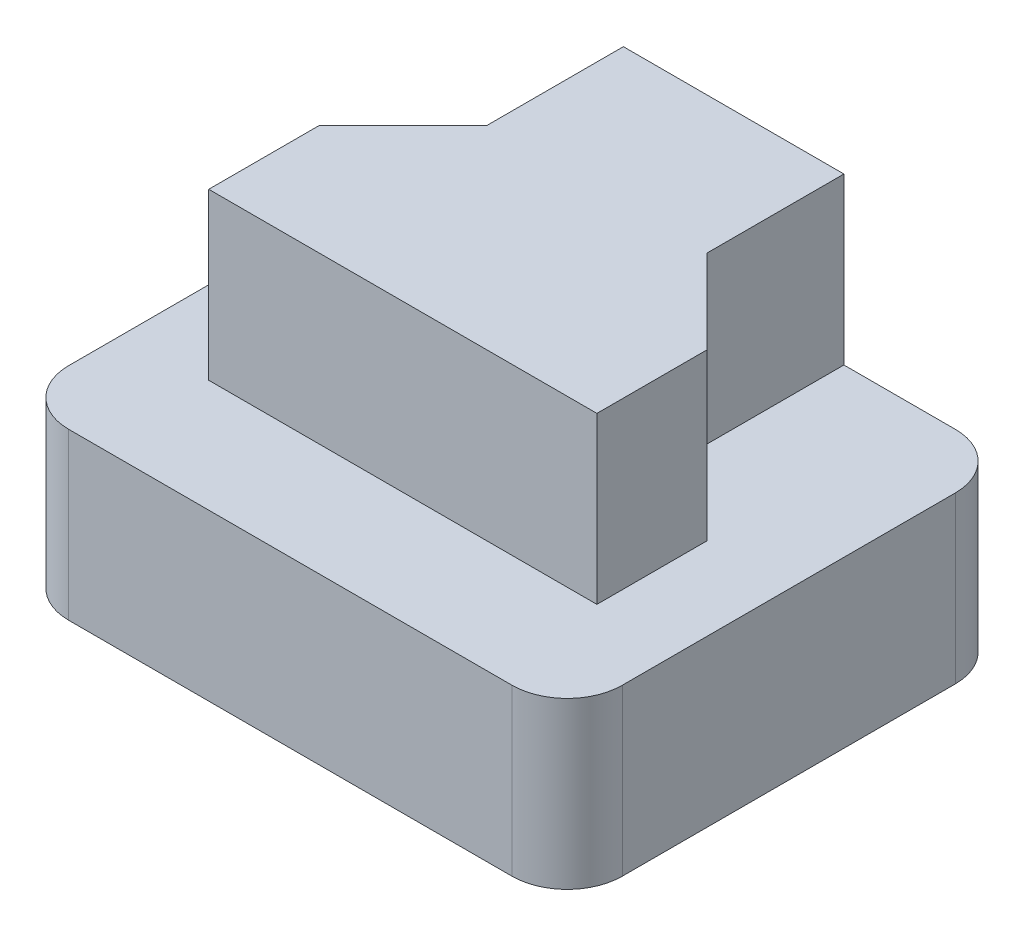
ISO-10303-21;
HEADER;
FILE_DESCRIPTION(('STEP AP214'),'2;1');
FILE_NAME('part.step','',(''),(''),'','','');
FILE_SCHEMA(('AUTOMOTIVE_DESIGN { 1 0 10303 214 1 1 1 1 }'));
ENDSEC;
DATA;
#1=APPLICATION_CONTEXT('core data for automotive mechanical design processes');
#2=APPLICATION_PROTOCOL_DEFINITION('international standard','automotive_design',2000,#1);
#3=PRODUCT_CONTEXT('',#1,'mechanical');
#4=PRODUCT('Part','Part','',(#3));
#5=PRODUCT_RELATED_PRODUCT_CATEGORY('part','',(#4));
#6=PRODUCT_DEFINITION_FORMATION('','',#4);
#7=PRODUCT_DEFINITION_CONTEXT('part definition',#1,'design');
#8=PRODUCT_DEFINITION('design','',#6,#7);
#9=PRODUCT_DEFINITION_SHAPE('','',#8);
#10=(LENGTH_UNIT() NAMED_UNIT(*) SI_UNIT(.MILLI.,.METRE.));
#11=(NAMED_UNIT(*) PLANE_ANGLE_UNIT() SI_UNIT($,.RADIAN.));
#12=(NAMED_UNIT(*) SI_UNIT($,.STERADIAN.) SOLID_ANGLE_UNIT());
#13=UNCERTAINTY_MEASURE_WITH_UNIT(LENGTH_MEASURE(1.E-05),#10,'distance_accuracy_value','');
#14=(GEOMETRIC_REPRESENTATION_CONTEXT(3) GLOBAL_UNCERTAINTY_ASSIGNED_CONTEXT((#13)) GLOBAL_UNIT_ASSIGNED_CONTEXT((#10,
#11,#12)) REPRESENTATION_CONTEXT('',''));
#15=CARTESIAN_POINT('',(0.,0.,0.));
#16=DIRECTION('',(0.,0.,1.));
#17=DIRECTION('',(1.,0.,0.));
#18=AXIS2_PLACEMENT_3D('',#15,#16,#17);
#19=CARTESIAN_POINT('',(5.02,3.,-4.02));
#20=DIRECTION('',(1.,0.,0.));
#21=DIRECTION('',(0.,0.,-1.));
#22=AXIS2_PLACEMENT_3D('',#19,#20,#21);
#23=PLANE('',#22);
#24=DIRECTION('',(0.,0.,1.));
#25=VECTOR('',#24,1.);
#26=CARTESIAN_POINT('',(5.02,3.,-4.02));
#27=LINE('',#26,#25);
#28=CARTESIAN_POINT('',(5.02,3.,-3.02));
#29=VERTEX_POINT('',#28);
#30=CARTESIAN_POINT('',(5.02,3.,3.02));
#31=VERTEX_POINT('',#30);
#32=EDGE_CURVE('E234',#29,#31,#27,.T.);
#33=ORIENTED_EDGE('',*,*,#32,.T.);
#34=DIRECTION('',(0.,-1.,0.));
#35=VECTOR('',#34,1.);
#36=CARTESIAN_POINT('',(5.02,3.,3.02));
#37=LINE('',#36,#35);
#38=CARTESIAN_POINT('',(5.02,0.,3.02));
#39=VERTEX_POINT('',#38);
#40=EDGE_CURVE('E257',#31,#39,#37,.T.);
#41=ORIENTED_EDGE('',*,*,#40,.T.);
#42=DIRECTION('',(0.,0.,1.));
#43=VECTOR('',#42,1.);
#44=CARTESIAN_POINT('',(5.02,0.,-4.02));
#45=LINE('',#44,#43);
#46=CARTESIAN_POINT('',(5.02,0.,-3.02));
#47=VERTEX_POINT('',#46);
#48=EDGE_CURVE('E221',#47,#39,#45,.T.);
#49=ORIENTED_EDGE('',*,*,#48,.F.);
#50=DIRECTION('',(0.,-1.,0.));
#51=VECTOR('',#50,1.);
#52=CARTESIAN_POINT('',(5.02,3.,-3.02));
#53=LINE('',#52,#51);
#54=EDGE_CURVE('E246',#47,#29,#53,.F.);
#55=ORIENTED_EDGE('',*,*,#54,.T.);
#56=EDGE_LOOP('',(#33,#41,#49,#55));
#57=FACE_BOUND('',#56,.T.);
#58=ADVANCED_FACE('F45',(#57),#23,.T.);
#59=CARTESIAN_POINT('',(5.02,3.,-4.02));
#60=DIRECTION('',(0.,0.,1.));
#61=DIRECTION('',(1.,0.,0.));
#62=AXIS2_PLACEMENT_3D('',#59,#60,#61);
#63=PLANE('',#62);
#64=DIRECTION('',(-1.,0.,0.));
#65=VECTOR('',#64,1.);
#66=CARTESIAN_POINT('',(5.02,0.,-4.02));
#67=LINE('',#66,#65);
#68=CARTESIAN_POINT('',(4.02,0.,-4.02));
#69=VERTEX_POINT('',#68);
#70=CARTESIAN_POINT('',(-4.02,0.,-4.02));
#71=VERTEX_POINT('',#70);
#72=EDGE_CURVE('E238',#69,#71,#67,.T.);
#73=ORIENTED_EDGE('',*,*,#72,.T.);
#74=DIRECTION('',(0.,-1.,0.));
#75=VECTOR('',#74,1.);
#76=CARTESIAN_POINT('',(-4.02,3.,-4.02));
#77=LINE('',#76,#75);
#78=CARTESIAN_POINT('',(-4.02,3.,-4.02));
#79=VERTEX_POINT('',#78);
#80=EDGE_CURVE('E11',#71,#79,#77,.F.);
#81=ORIENTED_EDGE('',*,*,#80,.T.);
#82=DIRECTION('',(-1.,0.,0.));
#83=VECTOR('',#82,1.);
#84=CARTESIAN_POINT('',(5.02,3.,-4.02));
#85=LINE('',#84,#83);
#86=CARTESIAN_POINT('',(-2.,3.,-4.02));
#87=VERTEX_POINT('',#86);
#88=EDGE_CURVE('E243',#87,#79,#85,.T.);
#89=ORIENTED_EDGE('',*,*,#88,.F.);
#90=DIRECTION('',(0.,-1.,0.));
#91=VECTOR('',#90,1.);
#92=CARTESIAN_POINT('',(-2.,6.,-4.02));
#93=LINE('',#92,#91);
#94=CARTESIAN_POINT('',(-2.,6.,-4.02));
#95=VERTEX_POINT('',#94);
#96=EDGE_CURVE('E229',#95,#87,#93,.T.);
#97=ORIENTED_EDGE('',*,*,#96,.F.);
#98=DIRECTION('',(1.,0.,0.));
#99=VECTOR('',#98,1.);
#100=CARTESIAN_POINT('',(0.,6.,-4.02));
#101=LINE('',#100,#99);
#102=CARTESIAN_POINT('',(2.,6.,-4.02));
#103=VERTEX_POINT('',#102);
#104=EDGE_CURVE('E196',#95,#103,#101,.T.);
#105=ORIENTED_EDGE('',*,*,#104,.T.);
#106=DIRECTION('',(0.,-1.,0.));
#107=VECTOR('',#106,1.);
#108=CARTESIAN_POINT('',(2.,6.,-4.02));
#109=LINE('',#108,#107);
#110=CARTESIAN_POINT('',(2.,3.,-4.02));
#111=VERTEX_POINT('',#110);
#112=EDGE_CURVE('E226',#103,#111,#109,.T.);
#113=ORIENTED_EDGE('',*,*,#112,.T.);
#114=CARTESIAN_POINT('',(4.02,3.,-4.02));
#115=VERTEX_POINT('',#114);
#116=EDGE_CURVE('E244',#115,#111,#85,.T.);
#117=ORIENTED_EDGE('',*,*,#116,.F.);
#118=DIRECTION('',(0.,-1.,0.));
#119=VECTOR('',#118,1.);
#120=CARTESIAN_POINT('',(4.02,0.,-4.02));
#121=LINE('',#120,#119);
#122=EDGE_CURVE('E53',#115,#69,#121,.T.);
#123=ORIENTED_EDGE('',*,*,#122,.T.);
#124=EDGE_LOOP('',(#73,#81,#89,#97,#105,#113,#117,#123));
#125=FACE_BOUND('',#124,.T.);
#126=ADVANCED_FACE('F287',(#125),#63,.F.);
#127=CARTESIAN_POINT('',(-5.02,3.,-4.02));
#128=DIRECTION('',(1.,0.,0.));
#129=DIRECTION('',(0.,0.,-1.));
#130=AXIS2_PLACEMENT_3D('',#127,#128,#129);
#131=PLANE('',#130);
#132=DIRECTION('',(0.,0.,1.));
#133=VECTOR('',#132,1.);
#134=CARTESIAN_POINT('',(-5.02,0.,-4.02));
#135=LINE('',#134,#133);
#136=CARTESIAN_POINT('',(-5.02,0.,-3.02));
#137=VERTEX_POINT('',#136);
#138=CARTESIAN_POINT('',(-5.02,0.,3.02));
#139=VERTEX_POINT('',#138);
#140=EDGE_CURVE('E252',#137,#139,#135,.T.);
#141=ORIENTED_EDGE('',*,*,#140,.T.);
#142=DIRECTION('',(0.,-1.,0.));
#143=VECTOR('',#142,1.);
#144=CARTESIAN_POINT('',(-5.02,3.,3.02));
#145=LINE('',#144,#143);
#146=CARTESIAN_POINT('',(-5.02,3.,3.02));
#147=VERTEX_POINT('',#146);
#148=EDGE_CURVE('E68',#139,#147,#145,.F.);
#149=ORIENTED_EDGE('',*,*,#148,.T.);
#150=DIRECTION('',(0.,0.,1.));
#151=VECTOR('',#150,1.);
#152=CARTESIAN_POINT('',(-5.02,3.,-4.02));
#153=LINE('',#152,#151);
#154=CARTESIAN_POINT('',(-5.02,3.,-3.02));
#155=VERTEX_POINT('',#154);
#156=EDGE_CURVE('E241',#155,#147,#153,.T.);
#157=ORIENTED_EDGE('',*,*,#156,.F.);
#158=DIRECTION('',(0.,-1.,0.));
#159=VECTOR('',#158,1.);
#160=CARTESIAN_POINT('',(-5.02,3.,-3.02));
#161=LINE('',#160,#159);
#162=EDGE_CURVE('E280',#155,#137,#161,.T.);
#163=ORIENTED_EDGE('',*,*,#162,.T.);
#164=EDGE_LOOP('',(#141,#149,#157,#163));
#165=FACE_BOUND('',#164,.T.);
#166=ADVANCED_FACE('F298',(#165),#131,.F.);
#167=CARTESIAN_POINT('',(5.02,3.,4.02));
#168=DIRECTION('',(0.,0.,1.));
#169=DIRECTION('',(1.,0.,0.));
#170=AXIS2_PLACEMENT_3D('',#167,#168,#169);
#171=PLANE('',#170);
#172=DIRECTION('',(-1.,0.,0.));
#173=VECTOR('',#172,1.);
#174=CARTESIAN_POINT('',(5.02,0.,4.02));
#175=LINE('',#174,#173);
#176=CARTESIAN_POINT('',(4.02,0.,4.02));
#177=VERTEX_POINT('',#176);
#178=CARTESIAN_POINT('',(-4.02,0.,4.02));
#179=VERTEX_POINT('',#178);
#180=EDGE_CURVE('E249',#177,#179,#175,.T.);
#181=ORIENTED_EDGE('',*,*,#180,.F.);
#182=DIRECTION('',(0.,-1.,0.));
#183=VECTOR('',#182,1.);
#184=CARTESIAN_POINT('',(4.02,3.,4.02));
#185=LINE('',#184,#183);
#186=CARTESIAN_POINT('',(4.02,3.,4.02));
#187=VERTEX_POINT('',#186);
#188=EDGE_CURVE('E271',#177,#187,#185,.F.);
#189=ORIENTED_EDGE('',*,*,#188,.T.);
#190=DIRECTION('',(-1.,0.,0.));
#191=VECTOR('',#190,1.);
#192=CARTESIAN_POINT('',(5.02,3.,4.02));
#193=LINE('',#192,#191);
#194=CARTESIAN_POINT('',(-4.02,3.,4.02));
#195=VERTEX_POINT('',#194);
#196=EDGE_CURVE('E237',#187,#195,#193,.T.);
#197=ORIENTED_EDGE('',*,*,#196,.T.);
#198=DIRECTION('',(0.,-1.,0.));
#199=VECTOR('',#198,1.);
#200=CARTESIAN_POINT('',(-4.02,0.,4.02));
#201=LINE('',#200,#199);
#202=EDGE_CURVE('E268',#195,#179,#201,.T.);
#203=ORIENTED_EDGE('',*,*,#202,.T.);
#204=EDGE_LOOP('',(#181,#189,#197,#203));
#205=FACE_BOUND('',#204,.T.);
#206=ADVANCED_FACE('F308',(#205),#171,.T.);
#207=CARTESIAN_POINT('',(0.,3.,0.));
#208=DIRECTION('',(0.,-1.,0.));
#209=DIRECTION('',(0.,0.,-1.));
#210=AXIS2_PLACEMENT_3D('',#207,#208,#209);
#211=PLANE('',#210);
#212=ORIENTED_EDGE('',*,*,#196,.F.);
#213=CARTESIAN_POINT('',(4.02,3.,3.02));
#214=DIRECTION('',(0.,-1.,0.));
#215=DIRECTION('',(0.,0.,-1.));
#216=AXIS2_PLACEMENT_3D('',#213,#214,#215);
#217=CIRCLE('',#216,1.);
#218=EDGE_CURVE('E278',#187,#31,#217,.F.);
#219=ORIENTED_EDGE('',*,*,#218,.T.);
#220=ORIENTED_EDGE('',*,*,#32,.F.);
#221=CARTESIAN_POINT('',(4.02,3.,-3.02));
#222=DIRECTION('',(0.,-1.,0.));
#223=DIRECTION('',(0.,0.,-1.));
#224=AXIS2_PLACEMENT_3D('',#221,#222,#223);
#225=CIRCLE('',#224,1.);
#226=EDGE_CURVE('E60',#29,#115,#225,.F.);
#227=ORIENTED_EDGE('',*,*,#226,.T.);
#228=ORIENTED_EDGE('',*,*,#116,.T.);
#229=DIRECTION('',(0.,0.,1.));
#230=VECTOR('',#229,1.);
#231=CARTESIAN_POINT('',(2.,3.,0.));
#232=LINE('',#231,#230);
#233=CARTESIAN_POINT('',(2.,3.,-1.54000000000001));
#234=VERTEX_POINT('',#233);
#235=EDGE_CURVE('E215',#111,#234,#232,.T.);
#236=ORIENTED_EDGE('',*,*,#235,.T.);
#237=DIRECTION('',(0.707106781186546,0.,0.707106781186549));
#238=VECTOR('',#237,1.);
#239=CARTESIAN_POINT('',(1.77000000000001,3.,-1.77));
#240=LINE('',#239,#238);
#241=CARTESIAN_POINT('',(3.52,3.,-0.0199999999999998));
#242=VERTEX_POINT('',#241);
#243=EDGE_CURVE('E189',#234,#242,#240,.T.);
#244=ORIENTED_EDGE('',*,*,#243,.T.);
#245=DIRECTION('',(0.,0.,1.));
#246=VECTOR('',#245,1.);
#247=CARTESIAN_POINT('',(3.52,3.,0.));
#248=LINE('',#247,#246);
#249=CARTESIAN_POINT('',(3.52,3.,1.98));
#250=VERTEX_POINT('',#249);
#251=EDGE_CURVE('E186',#242,#250,#248,.T.);
#252=ORIENTED_EDGE('',*,*,#251,.T.);
#253=DIRECTION('',(-1.,0.,0.));
#254=VECTOR('',#253,1.);
#255=CARTESIAN_POINT('',(0.,3.,1.98));
#256=LINE('',#255,#254);
#257=CARTESIAN_POINT('',(-3.52,3.,1.98));
#258=VERTEX_POINT('',#257);
#259=EDGE_CURVE('E206',#250,#258,#256,.T.);
#260=ORIENTED_EDGE('',*,*,#259,.T.);
#261=DIRECTION('',(0.,0.,-1.));
#262=VECTOR('',#261,1.);
#263=CARTESIAN_POINT('',(-3.52,3.,0.));
#264=LINE('',#263,#262);
#265=CARTESIAN_POINT('',(-3.52,3.,-0.019999999999999));
#266=VERTEX_POINT('',#265);
#267=EDGE_CURVE('E165',#258,#266,#264,.T.);
#268=ORIENTED_EDGE('',*,*,#267,.T.);
#269=DIRECTION('',(0.707106781186546,0.,-0.707106781186549));
#270=VECTOR('',#269,1.);
#271=CARTESIAN_POINT('',(-1.77000000000001,3.,-1.77));
#272=LINE('',#271,#270);
#273=CARTESIAN_POINT('',(-2.,3.,-1.54000000000001));
#274=VERTEX_POINT('',#273);
#275=EDGE_CURVE('E209',#266,#274,#272,.T.);
#276=ORIENTED_EDGE('',*,*,#275,.T.);
#277=DIRECTION('',(0.,0.,-1.));
#278=VECTOR('',#277,1.);
#279=CARTESIAN_POINT('',(-2.,3.,0.));
#280=LINE('',#279,#278);
#281=EDGE_CURVE('E212',#274,#87,#280,.T.);
#282=ORIENTED_EDGE('',*,*,#281,.T.);
#283=ORIENTED_EDGE('',*,*,#88,.T.);
#284=CARTESIAN_POINT('',(-4.02,3.,-3.02));
#285=DIRECTION('',(0.,-1.,0.));
#286=DIRECTION('',(0.,0.,-1.));
#287=AXIS2_PLACEMENT_3D('',#284,#285,#286);
#288=CIRCLE('',#287,1.);
#289=EDGE_CURVE('E274',#79,#155,#288,.F.);
#290=ORIENTED_EDGE('',*,*,#289,.T.);
#291=ORIENTED_EDGE('',*,*,#156,.T.);
#292=CARTESIAN_POINT('',(-4.02,3.,3.02));
#293=DIRECTION('',(0.,-1.,0.));
#294=DIRECTION('',(0.,0.,-1.));
#295=AXIS2_PLACEMENT_3D('',#292,#293,#294);
#296=CIRCLE('',#295,1.);
#297=EDGE_CURVE('E276',#147,#195,#296,.F.);
#298=ORIENTED_EDGE('',*,*,#297,.T.);
#299=EDGE_LOOP('',(#212,#219,#220,#227,#228,#236,#244,#252,#260,#268,#276,#282,#283,#290,#291,#298));
#300=FACE_BOUND('',#299,.T.);
#301=ADVANCED_FACE('F301',(#300),#211,.F.);
#302=CARTESIAN_POINT('',(0.,0.,0.));
#303=DIRECTION('',(0.,-1.,0.));
#304=DIRECTION('',(0.,0.,-1.));
#305=AXIS2_PLACEMENT_3D('',#302,#303,#304);
#306=PLANE('',#305);
#307=ORIENTED_EDGE('',*,*,#48,.T.);
#308=CARTESIAN_POINT('',(4.02,0.,3.02));
#309=DIRECTION('',(0.,-1.,0.));
#310=DIRECTION('',(0.,0.,-1.));
#311=AXIS2_PLACEMENT_3D('',#308,#309,#310);
#312=CIRCLE('',#311,1.);
#313=EDGE_CURVE('E266',#39,#177,#312,.T.);
#314=ORIENTED_EDGE('',*,*,#313,.T.);
#315=ORIENTED_EDGE('',*,*,#180,.T.);
#316=CARTESIAN_POINT('',(-4.02,0.,3.02));
#317=DIRECTION('',(0.,-1.,0.));
#318=DIRECTION('',(0.,0.,-1.));
#319=AXIS2_PLACEMENT_3D('',#316,#317,#318);
#320=CIRCLE('',#319,1.);
#321=EDGE_CURVE('E264',#179,#139,#320,.T.);
#322=ORIENTED_EDGE('',*,*,#321,.T.);
#323=ORIENTED_EDGE('',*,*,#140,.F.);
#324=CARTESIAN_POINT('',(-4.02,0.,-3.02));
#325=DIRECTION('',(0.,-1.,0.));
#326=DIRECTION('',(0.,0.,-1.));
#327=AXIS2_PLACEMENT_3D('',#324,#325,#326);
#328=CIRCLE('',#327,1.);
#329=EDGE_CURVE('E262',#137,#71,#328,.T.);
#330=ORIENTED_EDGE('',*,*,#329,.T.);
#331=ORIENTED_EDGE('',*,*,#72,.F.);
#332=CARTESIAN_POINT('',(4.02,0.,-3.02));
#333=DIRECTION('',(0.,-1.,0.));
#334=DIRECTION('',(0.,0.,-1.));
#335=AXIS2_PLACEMENT_3D('',#332,#333,#334);
#336=CIRCLE('',#335,1.);
#337=EDGE_CURVE('E260',#69,#47,#336,.T.);
#338=ORIENTED_EDGE('',*,*,#337,.T.);
#339=EDGE_LOOP('',(#307,#314,#315,#322,#323,#330,#331,#338));
#340=FACE_BOUND('',#339,.T.);
#341=ADVANCED_FACE('F291',(#340),#306,.T.);
#342=CARTESIAN_POINT('',(0.,6.,1.98));
#343=DIRECTION('',(0.,0.,1.));
#344=DIRECTION('',(1.,0.,0.));
#345=AXIS2_PLACEMENT_3D('',#342,#343,#344);
#346=PLANE('',#345);
#347=ORIENTED_EDGE('',*,*,#259,.F.);
#348=DIRECTION('',(0.,-1.,0.));
#349=VECTOR('',#348,1.);
#350=CARTESIAN_POINT('',(3.52,6.,1.98));
#351=LINE('',#350,#349);
#352=CARTESIAN_POINT('',(3.52,6.,1.98));
#353=VERTEX_POINT('',#352);
#354=EDGE_CURVE('E185',#353,#250,#351,.T.);
#355=ORIENTED_EDGE('',*,*,#354,.F.);
#356=DIRECTION('',(-1.,0.,0.));
#357=VECTOR('',#356,1.);
#358=CARTESIAN_POINT('',(0.,6.,1.98));
#359=LINE('',#358,#357);
#360=CARTESIAN_POINT('',(-3.52,6.,1.98));
#361=VERTEX_POINT('',#360);
#362=EDGE_CURVE('E177',#353,#361,#359,.T.);
#363=ORIENTED_EDGE('',*,*,#362,.T.);
#364=DIRECTION('',(0.,-1.,0.));
#365=VECTOR('',#364,1.);
#366=CARTESIAN_POINT('',(-3.52,6.,1.98));
#367=LINE('',#366,#365);
#368=EDGE_CURVE('E160',#361,#258,#367,.T.);
#369=ORIENTED_EDGE('',*,*,#368,.T.);
#370=EDGE_LOOP('',(#347,#355,#363,#369));
#371=FACE_BOUND('',#370,.T.);
#372=ADVANCED_FACE('F183',(#371),#346,.T.);
#373=CARTESIAN_POINT('',(3.52,6.,0.));
#374=DIRECTION('',(1.,0.,0.));
#375=DIRECTION('',(0.,0.,-1.));
#376=AXIS2_PLACEMENT_3D('',#373,#374,#375);
#377=PLANE('',#376);
#378=ORIENTED_EDGE('',*,*,#251,.F.);
#379=DIRECTION('',(0.,-1.,0.));
#380=VECTOR('',#379,1.);
#381=CARTESIAN_POINT('',(3.52,6.,-0.0199999999999998));
#382=LINE('',#381,#380);
#383=CARTESIAN_POINT('',(3.52,6.,-0.0199999999999998));
#384=VERTEX_POINT('',#383);
#385=EDGE_CURVE('E222',#384,#242,#382,.T.);
#386=ORIENTED_EDGE('',*,*,#385,.F.);
#387=DIRECTION('',(0.,0.,1.));
#388=VECTOR('',#387,1.);
#389=CARTESIAN_POINT('',(3.52,6.,0.));
#390=LINE('',#389,#388);
#391=EDGE_CURVE('E170',#384,#353,#390,.T.);
#392=ORIENTED_EDGE('',*,*,#391,.T.);
#393=ORIENTED_EDGE('',*,*,#354,.T.);
#394=EDGE_LOOP('',(#378,#386,#392,#393));
#395=FACE_BOUND('',#394,.T.);
#396=ADVANCED_FACE('F404',(#395),#377,.T.);
#397=CARTESIAN_POINT('',(1.77000000000001,6.,-1.77));
#398=DIRECTION('',(0.707106781186549,0.,-0.707106781186546));
#399=DIRECTION('',(-0.707106781186546,0.,-0.707106781186549));
#400=AXIS2_PLACEMENT_3D('',#397,#398,#399);
#401=PLANE('',#400);
#402=ORIENTED_EDGE('',*,*,#243,.F.);
#403=DIRECTION('',(0.,-1.,0.));
#404=VECTOR('',#403,1.);
#405=CARTESIAN_POINT('',(2.,6.,-1.54000000000001));
#406=LINE('',#405,#404);
#407=CARTESIAN_POINT('',(2.,6.,-1.54000000000001));
#408=VERTEX_POINT('',#407);
#409=EDGE_CURVE('E224',#408,#234,#406,.T.);
#410=ORIENTED_EDGE('',*,*,#409,.F.);
#411=DIRECTION('',(0.707106781186546,0.,0.707106781186549));
#412=VECTOR('',#411,1.);
#413=CARTESIAN_POINT('',(1.77000000000001,6.,-1.77));
#414=LINE('',#413,#412);
#415=EDGE_CURVE('E202',#408,#384,#414,.T.);
#416=ORIENTED_EDGE('',*,*,#415,.T.);
#417=ORIENTED_EDGE('',*,*,#385,.T.);
#418=EDGE_LOOP('',(#402,#410,#416,#417));
#419=FACE_BOUND('',#418,.T.);
#420=ADVANCED_FACE('F395',(#419),#401,.T.);
#421=CARTESIAN_POINT('',(2.,6.,0.));
#422=DIRECTION('',(1.,0.,0.));
#423=DIRECTION('',(0.,0.,-1.));
#424=AXIS2_PLACEMENT_3D('',#421,#422,#423);
#425=PLANE('',#424);
#426=ORIENTED_EDGE('',*,*,#235,.F.);
#427=ORIENTED_EDGE('',*,*,#112,.F.);
#428=DIRECTION('',(0.,0.,1.));
#429=VECTOR('',#428,1.);
#430=CARTESIAN_POINT('',(2.,6.,0.));
#431=LINE('',#430,#429);
#432=EDGE_CURVE('E199',#103,#408,#431,.T.);
#433=ORIENTED_EDGE('',*,*,#432,.T.);
#434=ORIENTED_EDGE('',*,*,#409,.T.);
#435=EDGE_LOOP('',(#426,#427,#433,#434));
#436=FACE_BOUND('',#435,.T.);
#437=ADVANCED_FACE('F386',(#436),#425,.T.);
#438=CARTESIAN_POINT('',(-2.,6.,0.));
#439=DIRECTION('',(-1.,0.,0.));
#440=DIRECTION('',(0.,0.,1.));
#441=AXIS2_PLACEMENT_3D('',#438,#439,#440);
#442=PLANE('',#441);
#443=ORIENTED_EDGE('',*,*,#281,.F.);
#444=DIRECTION('',(0.,-1.,0.));
#445=VECTOR('',#444,1.);
#446=CARTESIAN_POINT('',(-2.,6.,-1.54000000000001));
#447=LINE('',#446,#445);
#448=CARTESIAN_POINT('',(-2.,6.,-1.54000000000001));
#449=VERTEX_POINT('',#448);
#450=EDGE_CURVE('E231',#449,#274,#447,.T.);
#451=ORIENTED_EDGE('',*,*,#450,.F.);
#452=DIRECTION('',(0.,0.,-1.));
#453=VECTOR('',#452,1.);
#454=CARTESIAN_POINT('',(-2.,6.,0.));
#455=LINE('',#454,#453);
#456=EDGE_CURVE('E193',#449,#95,#455,.T.);
#457=ORIENTED_EDGE('',*,*,#456,.T.);
#458=ORIENTED_EDGE('',*,*,#96,.T.);
#459=EDGE_LOOP('',(#443,#451,#457,#458));
#460=FACE_BOUND('',#459,.T.);
#461=ADVANCED_FACE('F377',(#460),#442,.T.);
#462=CARTESIAN_POINT('',(-1.77000000000001,6.,-1.77));
#463=DIRECTION('',(-0.707106781186549,0.,-0.707106781186546));
#464=DIRECTION('',(-0.707106781186546,0.,0.707106781186549));
#465=AXIS2_PLACEMENT_3D('',#462,#463,#464);
#466=PLANE('',#465);
#467=ORIENTED_EDGE('',*,*,#275,.F.);
#468=DIRECTION('',(0.,-1.,0.));
#469=VECTOR('',#468,1.);
#470=CARTESIAN_POINT('',(-3.52,6.,-0.019999999999999));
#471=LINE('',#470,#469);
#472=CARTESIAN_POINT('',(-3.52,6.,-0.019999999999999));
#473=VERTEX_POINT('',#472);
#474=EDGE_CURVE('E169',#473,#266,#471,.T.);
#475=ORIENTED_EDGE('',*,*,#474,.F.);
#476=DIRECTION('',(0.707106781186546,0.,-0.707106781186549));
#477=VECTOR('',#476,1.);
#478=CARTESIAN_POINT('',(-1.77000000000001,6.,-1.77));
#479=LINE('',#478,#477);
#480=EDGE_CURVE('E181',#473,#449,#479,.T.);
#481=ORIENTED_EDGE('',*,*,#480,.T.);
#482=ORIENTED_EDGE('',*,*,#450,.T.);
#483=EDGE_LOOP('',(#467,#475,#481,#482));
#484=FACE_BOUND('',#483,.T.);
#485=ADVANCED_FACE('F369',(#484),#466,.T.);
#486=CARTESIAN_POINT('',(-3.52,6.,0.));
#487=DIRECTION('',(-1.,0.,0.));
#488=DIRECTION('',(0.,0.,1.));
#489=AXIS2_PLACEMENT_3D('',#486,#487,#488);
#490=PLANE('',#489);
#491=ORIENTED_EDGE('',*,*,#267,.F.);
#492=ORIENTED_EDGE('',*,*,#368,.F.);
#493=DIRECTION('',(0.,0.,-1.));
#494=VECTOR('',#493,1.);
#495=CARTESIAN_POINT('',(-3.52,6.,0.));
#496=LINE('',#495,#494);
#497=EDGE_CURVE('E163',#361,#473,#496,.T.);
#498=ORIENTED_EDGE('',*,*,#497,.T.);
#499=ORIENTED_EDGE('',*,*,#474,.T.);
#500=EDGE_LOOP('',(#491,#492,#498,#499));
#501=FACE_BOUND('',#500,.T.);
#502=ADVANCED_FACE('F162',(#501),#490,.T.);
#503=CARTESIAN_POINT('',(0.,6.,0.));
#504=DIRECTION('',(0.,-1.,0.));
#505=DIRECTION('',(0.,0.,-1.));
#506=AXIS2_PLACEMENT_3D('',#503,#504,#505);
#507=PLANE('',#506);
#508=ORIENTED_EDGE('',*,*,#362,.F.);
#509=ORIENTED_EDGE('',*,*,#391,.F.);
#510=ORIENTED_EDGE('',*,*,#415,.F.);
#511=ORIENTED_EDGE('',*,*,#432,.F.);
#512=ORIENTED_EDGE('',*,*,#104,.F.);
#513=ORIENTED_EDGE('',*,*,#456,.F.);
#514=ORIENTED_EDGE('',*,*,#480,.F.);
#515=ORIENTED_EDGE('',*,*,#497,.F.);
#516=EDGE_LOOP('',(#508,#509,#510,#511,#512,#513,#514,#515));
#517=FACE_BOUND('',#516,.T.);
#518=ADVANCED_FACE('F175',(#517),#507,.F.);
#519=CARTESIAN_POINT('',(4.02,3.,3.02));
#520=DIRECTION('',(0.,-1.,0.));
#521=DIRECTION('',(0.,0.,-1.));
#522=AXIS2_PLACEMENT_3D('',#519,#520,#521);
#523=CYLINDRICAL_SURFACE('',#522,1.);
#524=ORIENTED_EDGE('',*,*,#218,.F.);
#525=ORIENTED_EDGE('',*,*,#188,.F.);
#526=ORIENTED_EDGE('',*,*,#313,.F.);
#527=ORIENTED_EDGE('',*,*,#40,.F.);
#528=EDGE_LOOP('',(#524,#525,#526,#527));
#529=FACE_BOUND('',#528,.T.);
#530=ADVANCED_FACE('F313',(#529),#523,.T.);
#531=CARTESIAN_POINT('',(-4.02,3.,3.02));
#532=DIRECTION('',(0.,1.,0.));
#533=DIRECTION('',(0.,0.,1.));
#534=AXIS2_PLACEMENT_3D('',#531,#532,#533);
#535=CYLINDRICAL_SURFACE('',#534,1.);
#536=ORIENTED_EDGE('',*,*,#297,.F.);
#537=ORIENTED_EDGE('',*,*,#148,.F.);
#538=ORIENTED_EDGE('',*,*,#321,.F.);
#539=ORIENTED_EDGE('',*,*,#202,.F.);
#540=EDGE_LOOP('',(#536,#537,#538,#539));
#541=FACE_BOUND('',#540,.T.);
#542=ADVANCED_FACE('F305',(#541),#535,.T.);
#543=CARTESIAN_POINT('',(-4.02,3.,-3.02));
#544=DIRECTION('',(0.,-1.,0.));
#545=DIRECTION('',(0.,0.,-1.));
#546=AXIS2_PLACEMENT_3D('',#543,#544,#545);
#547=CYLINDRICAL_SURFACE('',#546,1.);
#548=ORIENTED_EDGE('',*,*,#289,.F.);
#549=ORIENTED_EDGE('',*,*,#80,.F.);
#550=ORIENTED_EDGE('',*,*,#329,.F.);
#551=ORIENTED_EDGE('',*,*,#162,.F.);
#552=EDGE_LOOP('',(#548,#549,#550,#551));
#553=FACE_BOUND('',#552,.T.);
#554=ADVANCED_FACE('F297',(#553),#547,.T.);
#555=CARTESIAN_POINT('',(4.02,3.,-3.02));
#556=DIRECTION('',(0.,1.,0.));
#557=DIRECTION('',(0.,0.,1.));
#558=AXIS2_PLACEMENT_3D('',#555,#556,#557);
#559=CYLINDRICAL_SURFACE('',#558,1.);
#560=ORIENTED_EDGE('',*,*,#226,.F.);
#561=ORIENTED_EDGE('',*,*,#54,.F.);
#562=ORIENTED_EDGE('',*,*,#337,.F.);
#563=ORIENTED_EDGE('',*,*,#122,.F.);
#564=EDGE_LOOP('',(#560,#561,#562,#563));
#565=FACE_BOUND('',#564,.T.);
#566=ADVANCED_FACE('F47',(#565),#559,.T.);
#567=CLOSED_SHELL('',(#58,#126,#166,#206,#301,#341,#372,#396,#420,#437,#461,#485,#502,#518,#530,
#542,#554,#566));
#568=MANIFOLD_SOLID_BREP('B2',#567);
#569=ADVANCED_BREP_SHAPE_REPRESENTATION('',(#18,#568),#14);
#570=SHAPE_DEFINITION_REPRESENTATION(#9,#569);
ENDSEC;
END-ISO-10303-21;
